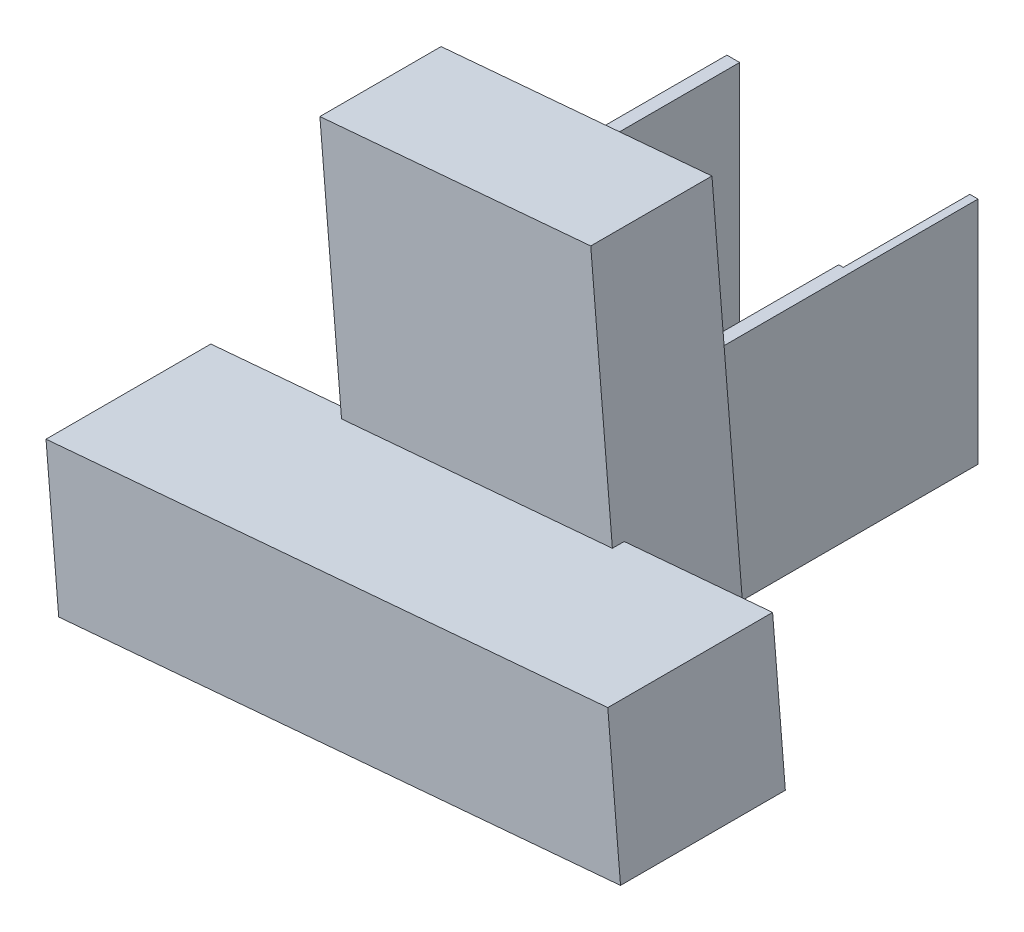
ISO-10303-21;
HEADER;
FILE_DESCRIPTION(('STEP AP214'),'2;1');
FILE_NAME('part.step','',(''),(''),'','','');
FILE_SCHEMA(('AUTOMOTIVE_DESIGN { 1 0 10303 214 1 1 1 1 }'));
ENDSEC;
DATA;
#1=APPLICATION_CONTEXT('core data for automotive mechanical design processes');
#2=APPLICATION_PROTOCOL_DEFINITION('international standard','automotive_design',2000,#1);
#3=PRODUCT_CONTEXT('',#1,'mechanical');
#4=PRODUCT('Part','Part','',(#3));
#5=PRODUCT_RELATED_PRODUCT_CATEGORY('part','',(#4));
#6=PRODUCT_DEFINITION_FORMATION('','',#4);
#7=PRODUCT_DEFINITION_CONTEXT('part definition',#1,'design');
#8=PRODUCT_DEFINITION('design','',#6,#7);
#9=PRODUCT_DEFINITION_SHAPE('','',#8);
#10=(LENGTH_UNIT() NAMED_UNIT(*) SI_UNIT(.MILLI.,.METRE.));
#11=(NAMED_UNIT(*) PLANE_ANGLE_UNIT() SI_UNIT($,.RADIAN.));
#12=(NAMED_UNIT(*) SI_UNIT($,.STERADIAN.) SOLID_ANGLE_UNIT());
#13=UNCERTAINTY_MEASURE_WITH_UNIT(LENGTH_MEASURE(1.E-05),#10,'distance_accuracy_value','');
#14=(GEOMETRIC_REPRESENTATION_CONTEXT(3) GLOBAL_UNCERTAINTY_ASSIGNED_CONTEXT((#13)) GLOBAL_UNIT_ASSIGNED_CONTEXT((#10,
#11,#12)) REPRESENTATION_CONTEXT('',''));
#15=CARTESIAN_POINT('',(0.,0.,0.));
#16=DIRECTION('',(0.,0.,1.));
#17=DIRECTION('',(1.,0.,0.));
#18=AXIS2_PLACEMENT_3D('',#15,#16,#17);
#19=CARTESIAN_POINT('',(-83.7586461575756,-4.10945026252005E-12,3.18615829159422E-12));
#20=DIRECTION('',(-1.,0.,0.));
#21=DIRECTION('',(0.,-1.,0.));
#22=AXIS2_PLACEMENT_3D('',#19,#20,#21);
#23=PLANE('',#22);
#24=DIRECTION('',(0.,1.,0.));
#25=VECTOR('',#24,1.);
#26=CARTESIAN_POINT('',(-83.7586461575911,-4.10945026252279E-12,-406.739222071192));
#27=LINE('',#26,#25);
#28=CARTESIAN_POINT('',(-83.7586461575777,-281.085149465199,-406.739222071192));
#29=VERTEX_POINT('',#28);
#30=CARTESIAN_POINT('',(-83.7586461575783,-260.42777062127,-406.739222071192));
#31=VERTEX_POINT('',#30);
#32=EDGE_CURVE('E547',#29,#31,#27,.T.);
#33=ORIENTED_EDGE('',*,*,#32,.F.);
#34=DIRECTION('',(0.,0.,1.));
#35=VECTOR('',#34,1.);
#36=CARTESIAN_POINT('',(-83.7586461575618,-281.085149465199,3.18615829159364E-12));
#37=LINE('',#36,#35);
#38=CARTESIAN_POINT('',(-83.7586461575781,-281.085149465199,-428.087784445097));
#39=VERTEX_POINT('',#38);
#40=EDGE_CURVE('E544',#39,#29,#37,.T.);
#41=ORIENTED_EDGE('',*,*,#40,.F.);
#42=DIRECTION('',(0.,1.,0.));
#43=VECTOR('',#42,1.);
#44=CARTESIAN_POINT('',(-83.7586461575791,-260.42777062127,-428.087784445097));
#45=LINE('',#44,#43);
#46=CARTESIAN_POINT('',(-83.7586461575772,-299.17786280097,-428.087784445097));
#47=VERTEX_POINT('',#46);
#48=EDGE_CURVE('E511',#47,#39,#45,.T.);
#49=ORIENTED_EDGE('',*,*,#48,.F.);
#50=DIRECTION('',(0.,0.,-1.));
#51=VECTOR('',#50,1.);
#52=CARTESIAN_POINT('',(-83.7586461575756,-299.17786280097,-384.674952402111));
#53=LINE('',#52,#51);
#54=CARTESIAN_POINT('',(-83.7586461575756,-299.17786280097,-384.674952402111));
#55=VERTEX_POINT('',#54);
#56=EDGE_CURVE('E507',#55,#47,#53,.T.);
#57=ORIENTED_EDGE('',*,*,#56,.F.);
#58=DIRECTION('',(0.,-1.,0.));
#59=VECTOR('',#58,1.);
#60=CARTESIAN_POINT('',(-83.7586461575775,-260.42777062127,-384.674952402111));
#61=LINE('',#60,#59);
#62=CARTESIAN_POINT('',(-83.7586461575756,-298.875536418522,-384.674952402235));
#63=VERTEX_POINT('',#62);
#64=EDGE_CURVE('E502',#63,#55,#61,.T.);
#65=ORIENTED_EDGE('',*,*,#64,.F.);
#66=CARTESIAN_POINT('',(-83.7586461575775,-260.42777062127,-384.674952402111));
#67=VERTEX_POINT('',#66);
#68=EDGE_CURVE('E503',#67,#63,#61,.T.);
#69=ORIENTED_EDGE('',*,*,#68,.F.);
#70=DIRECTION('',(0.,0.,1.));
#71=VECTOR('',#70,1.);
#72=CARTESIAN_POINT('',(-83.7586461575775,-260.42777062127,-384.674952402111));
#73=LINE('',#72,#71);
#74=EDGE_CURVE('E499',#31,#67,#73,.T.);
#75=ORIENTED_EDGE('',*,*,#74,.F.);
#76=EDGE_LOOP('',(#33,#41,#49,#57,#65,#69,#75));
#77=FACE_BOUND('',#76,.T.);
#78=DIRECTION('',(0.,0.,-1.));
#79=VECTOR('',#78,1.);
#80=CARTESIAN_POINT('',(-83.7586461575627,-262.531491805785,3.18615829159373E-12));
#81=LINE('',#80,#79);
#82=CARTESIAN_POINT('',(-83.7586461575772,-262.531491805785,-384.973256852288));
#83=VERTEX_POINT('',#82);
#84=CARTESIAN_POINT('',(-83.7586461575776,-262.531491805785,-389.973256852288));
#85=VERTEX_POINT('',#84);
#86=EDGE_CURVE('E315',#83,#85,#81,.T.);
#87=ORIENTED_EDGE('',*,*,#86,.F.);
#88=DIRECTION('',(0.,-1.,0.));
#89=VECTOR('',#88,1.);
#90=CARTESIAN_POINT('',(-83.7586461575902,-4.10945026252076E-12,-384.973256852288));
#91=LINE('',#90,#89);
#92=CARTESIAN_POINT('',(-83.7586461575772,-268.275386182561,-384.973256852288));
#93=VERTEX_POINT('',#92);
#94=EDGE_CURVE('E253',#83,#93,#91,.T.);
#95=ORIENTED_EDGE('',*,*,#94,.T.);
#96=DIRECTION('',(0.,0.,1.));
#97=VECTOR('',#96,1.);
#98=CARTESIAN_POINT('',(-83.7586461575625,-268.275386182561,3.18615829159372E-12));
#99=LINE('',#98,#97);
#100=CARTESIAN_POINT('',(-83.7586461575774,-268.275386182561,-389.973256852288));
#101=VERTEX_POINT('',#100);
#102=EDGE_CURVE('E312',#101,#93,#99,.T.);
#103=ORIENTED_EDGE('',*,*,#102,.F.);
#104=DIRECTION('',(0.,-1.,0.));
#105=VECTOR('',#104,1.);
#106=CARTESIAN_POINT('',(-83.7586461575904,-4.10945026252077E-12,-389.973256852288));
#107=LINE('',#106,#105);
#108=EDGE_CURVE('E301',#85,#101,#107,.T.);
#109=ORIENTED_EDGE('',*,*,#108,.F.);
#110=EDGE_LOOP('',(#87,#95,#103,#109));
#111=FACE_BOUND('',#110,.T.);
#112=ADVANCED_FACE('F43',(#77,#111),#23,.T.);
#113=CARTESIAN_POINT('',(-121.658646157551,2.05978052856057E-12,4.48779256114984E-12));
#114=DIRECTION('',(-1.,0.,0.));
#115=DIRECTION('',(0.,0.,1.));
#116=AXIS2_PLACEMENT_3D('',#113,#114,#115);
#117=PLANE('',#116);
#118=DIRECTION('',(0.,0.,-1.));
#119=VECTOR('',#118,1.);
#120=CARTESIAN_POINT('',(-121.658646157569,-260.427770621154,-384.674952402174));
#121=LINE('',#120,#119);
#122=CARTESIAN_POINT('',(-121.658646157569,-260.427770621154,-384.674952402174));
#123=VERTEX_POINT('',#122);
#124=CARTESIAN_POINT('',(-121.658646157571,-260.427770621154,-427.936944683927));
#125=VERTEX_POINT('',#124);
#126=EDGE_CURVE('E318',#123,#125,#121,.T.);
#127=ORIENTED_EDGE('',*,*,#126,.F.);
#128=DIRECTION('',(0.,1.,0.));
#129=VECTOR('',#128,1.);
#130=CARTESIAN_POINT('',(-121.658646157569,-260.427770621154,-384.674952402174));
#131=LINE('',#130,#129);
#132=CARTESIAN_POINT('',(-121.65864615757,-299.769559667941,-384.674952402174));
#133=VERTEX_POINT('',#132);
#134=EDGE_CURVE('E329',#133,#123,#131,.T.);
#135=ORIENTED_EDGE('',*,*,#134,.F.);
#136=DIRECTION('',(0.,0.,1.));
#137=VECTOR('',#136,1.);
#138=CARTESIAN_POINT('',(-121.65864615757,-299.769559667941,-384.674952402174));
#139=LINE('',#138,#137);
#140=CARTESIAN_POINT('',(-121.658646157571,-299.769559667941,-427.936944683927));
#141=VERTEX_POINT('',#140);
#142=EDGE_CURVE('E326',#141,#133,#139,.T.);
#143=ORIENTED_EDGE('',*,*,#142,.F.);
#144=DIRECTION('',(0.,-1.,0.));
#145=VECTOR('',#144,1.);
#146=CARTESIAN_POINT('',(-121.658646157571,-260.427770621154,-427.936944683927));
#147=LINE('',#146,#145);
#148=EDGE_CURVE('E322',#125,#141,#147,.T.);
#149=ORIENTED_EDGE('',*,*,#148,.F.);
#150=EDGE_LOOP('',(#127,#135,#143,#149));
#151=FACE_BOUND('',#150,.T.);
#152=DIRECTION('',(0.,-1.,0.));
#153=VECTOR('',#152,1.);
#154=CARTESIAN_POINT('',(-121.658646157565,2.05978052856081E-12,-384.973256852288));
#155=LINE('',#154,#153);
#156=CARTESIAN_POINT('',(-121.658646157569,-262.531491805785,-384.973256852288));
#157=VERTEX_POINT('',#156);
#158=CARTESIAN_POINT('',(-121.658646157569,-268.275386182561,-384.973256852288));
#159=VERTEX_POINT('',#158);
#160=EDGE_CURVE('E11',#157,#159,#155,.T.);
#161=ORIENTED_EDGE('',*,*,#160,.F.);
#162=DIRECTION('',(0.,0.,-1.));
#163=VECTOR('',#162,1.);
#164=CARTESIAN_POINT('',(-121.658646157555,-262.531491805785,4.48779256115E-12));
#165=LINE('',#164,#163);
#166=CARTESIAN_POINT('',(-121.658646157569,-262.531491805785,-389.973256852288));
#167=VERTEX_POINT('',#166);
#168=EDGE_CURVE('E52',#157,#167,#165,.T.);
#169=ORIENTED_EDGE('',*,*,#168,.T.);
#170=DIRECTION('',(0.,-1.,0.));
#171=VECTOR('',#170,1.);
#172=CARTESIAN_POINT('',(-121.658646157565,2.05978052856081E-12,-389.973256852288));
#173=LINE('',#172,#171);
#174=CARTESIAN_POINT('',(-121.658646157569,-268.275386182561,-389.973256852288));
#175=VERTEX_POINT('',#174);
#176=EDGE_CURVE('E554',#167,#175,#173,.T.);
#177=ORIENTED_EDGE('',*,*,#176,.T.);
#178=DIRECTION('',(0.,0.,1.));
#179=VECTOR('',#178,1.);
#180=CARTESIAN_POINT('',(-121.658646157555,-268.275386182561,4.48779256115001E-12));
#181=LINE('',#180,#179);
#182=EDGE_CURVE('E558',#175,#159,#181,.T.);
#183=ORIENTED_EDGE('',*,*,#182,.T.);
#184=EDGE_LOOP('',(#161,#169,#177,#183));
#185=FACE_BOUND('',#184,.T.);
#186=ADVANCED_FACE('F565',(#151,#185),#117,.F.);
#187=CARTESIAN_POINT('',(-77.7037066635407,-298.35351939984,-384.674952402234));
#188=DIRECTION('',(0.,3.23272787236292E-12,-1.));
#189=DIRECTION('',(0.,1.,3.23272787236292E-12));
#190=AXIS2_PLACEMENT_3D('',#187,#188,#189);
#191=PLANE('',#190);
#192=DIRECTION('',(1.,0.,0.));
#193=VECTOR('',#192,1.);
#194=CARTESIAN_POINT('',(-77.70370666354,-260.427770621154,-384.674952402111));
#195=LINE('',#194,#193);
#196=CARTESIAN_POINT('',(-123.808646157569,-260.427770621154,-384.674952402174));
#197=VERTEX_POINT('',#196);
#198=EDGE_CURVE('E478',#197,#123,#195,.T.);
#199=ORIENTED_EDGE('',*,*,#198,.F.);
#200=DIRECTION('',(0.,1.,0.));
#201=VECTOR('',#200,1.);
#202=CARTESIAN_POINT('',(-123.808646157569,-260.427770621154,-384.674952402174));
#203=LINE('',#202,#201);
#204=CARTESIAN_POINT('',(-123.80864615757,-297.43618521484,-384.674952402174));
#205=VERTEX_POINT('',#204);
#206=EDGE_CURVE('E343',#205,#197,#203,.T.);
#207=ORIENTED_EDGE('',*,*,#206,.F.);
#208=DIRECTION('',(-0.0858947897904414,0.996304213123108,3.22071536107416E-12));
#209=VECTOR('',#208,1.);
#210=CARTESIAN_POINT('',(-123.389984816589,-302.292289512999,-384.674952402247));
#211=LINE('',#210,#209);
#212=CARTESIAN_POINT('',(-128.758409178492,-240.023276192805,-384.674952402045));
#213=VERTEX_POINT('',#212);
#214=EDGE_CURVE('E486',#205,#213,#211,.T.);
#215=ORIENTED_EDGE('',*,*,#214,.T.);
#216=DIRECTION('',(-0.996304213123108,-0.0858947897904416,-2.78428865275491E-13));
#217=VECTOR('',#216,1.);
#218=CARTESIAN_POINT('',(-83.0721310254432,-236.084506079646,-384.674952402033));
#219=LINE('',#218,#217);
#220=CARTESIAN_POINT('',(-83.0721310254432,-236.084506079646,-384.674952402033));
#221=VERTEX_POINT('',#220);
#222=EDGE_CURVE('E464',#221,#213,#219,.T.);
#223=ORIENTED_EDGE('',*,*,#222,.F.);
#224=DIRECTION('',(-0.0858947897904414,0.996304213123108,3.22071536107416E-12));
#225=VECTOR('',#224,1.);
#226=CARTESIAN_POINT('',(-77.7037066635407,-298.35351939984,-384.674952402234));
#227=LINE('',#226,#225);
#228=CARTESIAN_POINT('',(-77.7037066635407,-298.35351939984,-384.674952402234));
#229=VERTEX_POINT('',#228);
#230=EDGE_CURVE('E460',#229,#221,#227,.T.);
#231=ORIENTED_EDGE('',*,*,#230,.F.);
#232=DIRECTION('',(-0.996304213123108,-0.0858947897904416,-2.78428865275491E-13));
#233=VECTOR('',#232,1.);
#234=CARTESIAN_POINT('',(-77.7037066635407,-298.35351939984,-384.674952402234));
#235=LINE('',#234,#233);
#236=CARTESIAN_POINT('',(-81.6086461575756,-298.690177573686,-384.674952402111));
#237=VERTEX_POINT('',#236);
#238=EDGE_CURVE('E451',#229,#237,#235,.T.);
#239=ORIENTED_EDGE('',*,*,#238,.T.);
#240=DIRECTION('',(0.,-1.,0.));
#241=VECTOR('',#240,1.);
#242=CARTESIAN_POINT('',(-81.6086461575775,-260.42777062127,-384.674952402111));
#243=LINE('',#242,#241);
#244=CARTESIAN_POINT('',(-81.6086461575775,-260.42777062127,-384.674952402111));
#245=VERTEX_POINT('',#244);
#246=EDGE_CURVE('E519',#245,#237,#243,.T.);
#247=ORIENTED_EDGE('',*,*,#246,.F.);
#248=DIRECTION('',(-1.,0.,0.));
#249=VECTOR('',#248,1.);
#250=CARTESIAN_POINT('',(-81.6086461575775,-260.42777062127,-384.674952402111));
#251=LINE('',#250,#249);
#252=EDGE_CURVE('E540',#245,#67,#251,.T.);
#253=ORIENTED_EDGE('',*,*,#252,.T.);
#254=ORIENTED_EDGE('',*,*,#68,.T.);
#255=CARTESIAN_POINT('',(-123.389984816589,-302.292289512999,-384.674952402247));
#256=VERTEX_POINT('',#255);
#257=EDGE_CURVE('E449',#63,#256,#235,.T.);
#258=ORIENTED_EDGE('',*,*,#257,.T.);
#259=CARTESIAN_POINT('',(-123.607477974688,-299.769559667941,-384.674952402174));
#260=VERTEX_POINT('',#259);
#261=EDGE_CURVE('E482',#256,#260,#211,.T.);
#262=ORIENTED_EDGE('',*,*,#261,.T.);
#263=DIRECTION('',(1.,0.,0.));
#264=VECTOR('',#263,1.);
#265=CARTESIAN_POINT('',(-123.80864615757,-299.769559667941,-384.674952402174));
#266=LINE('',#265,#264);
#267=EDGE_CURVE('E348',#260,#133,#266,.T.);
#268=ORIENTED_EDGE('',*,*,#267,.T.);
#269=ORIENTED_EDGE('',*,*,#134,.T.);
#270=EDGE_LOOP('',(#199,#207,#215,#223,#231,#239,#247,#253,#254,#258,#262,#268,#269));
#271=FACE_BOUND('',#270,.T.);
#272=ADVANCED_FACE('F598',(#271),#191,.T.);
#273=CARTESIAN_POINT('',(-81.6086461575775,-260.42777062127,-384.674952402111));
#274=DIRECTION('',(0.,0.,-1.));
#275=DIRECTION('',(-1.,0.,0.));
#276=AXIS2_PLACEMENT_3D('',#273,#274,#275);
#277=PLANE('',#276);
#278=EDGE_CURVE('E456',#237,#63,#235,.T.);
#279=ORIENTED_EDGE('',*,*,#278,.T.);
#280=ORIENTED_EDGE('',*,*,#64,.T.);
#281=DIRECTION('',(-1.,0.,0.));
#282=VECTOR('',#281,1.);
#283=CARTESIAN_POINT('',(-81.6086461575756,-299.17786280097,-384.674952402111));
#284=LINE('',#283,#282);
#285=CARTESIAN_POINT('',(-81.6086461575756,-299.17786280097,-384.674952402111));
#286=VERTEX_POINT('',#285);
#287=EDGE_CURVE('E536',#286,#55,#284,.T.);
#288=ORIENTED_EDGE('',*,*,#287,.F.);
#289=EDGE_CURVE('E518',#237,#286,#243,.T.);
#290=ORIENTED_EDGE('',*,*,#289,.F.);
#291=EDGE_LOOP('',(#279,#280,#288,#290));
#292=FACE_BOUND('',#291,.T.);
#293=ADVANCED_FACE('F619',(#292),#277,.F.);
#294=CARTESIAN_POINT('',(-81.6086461575775,-260.42777062127,-384.674952402111));
#295=DIRECTION('',(0.,-1.,0.));
#296=DIRECTION('',(1.,0.,0.));
#297=AXIS2_PLACEMENT_3D('',#294,#295,#296);
#298=PLANE('',#297);
#299=DIRECTION('',(0.,0.,1.));
#300=VECTOR('',#299,1.);
#301=CARTESIAN_POINT('',(-82.9886461575637,-260.42777062127,-384.674952402111));
#302=LINE('',#301,#300);
#303=CARTESIAN_POINT('',(-82.9886461575654,-260.42777062127,-428.087784445097));
#304=VERTEX_POINT('',#303);
#305=CARTESIAN_POINT('',(-82.9886461575645,-260.42777062127,-406.739222071192));
#306=VERTEX_POINT('',#305);
#307=EDGE_CURVE('E382',#304,#306,#302,.T.);
#308=ORIENTED_EDGE('',*,*,#307,.T.);
#309=DIRECTION('',(-1.,0.,0.));
#310=VECTOR('',#309,1.);
#311=CARTESIAN_POINT('',(-81.6086461575783,-260.42777062127,-406.739222071192));
#312=LINE('',#311,#310);
#313=EDGE_CURVE('E378',#306,#31,#312,.T.);
#314=ORIENTED_EDGE('',*,*,#313,.T.);
#315=ORIENTED_EDGE('',*,*,#74,.T.);
#316=ORIENTED_EDGE('',*,*,#252,.F.);
#317=DIRECTION('',(0.,0.,1.));
#318=VECTOR('',#317,1.);
#319=CARTESIAN_POINT('',(-81.6086461575775,-260.42777062127,-384.674952402111));
#320=LINE('',#319,#318);
#321=CARTESIAN_POINT('',(-81.6086461575791,-260.42777062127,-428.087784445097));
#322=VERTEX_POINT('',#321);
#323=EDGE_CURVE('E515',#322,#245,#320,.T.);
#324=ORIENTED_EDGE('',*,*,#323,.F.);
#325=DIRECTION('',(-1.,0.,0.));
#326=VECTOR('',#325,1.);
#327=CARTESIAN_POINT('',(-81.6086461575791,-260.42777062127,-428.087784445097));
#328=LINE('',#327,#326);
#329=EDGE_CURVE('E529',#322,#304,#328,.T.);
#330=ORIENTED_EDGE('',*,*,#329,.T.);
#331=EDGE_LOOP('',(#308,#314,#315,#316,#324,#330));
#332=FACE_BOUND('',#331,.T.);
#333=ADVANCED_FACE('F45',(#332),#298,.F.);
#334=CARTESIAN_POINT('',(-81.6086461575756,-299.17786280097,-384.674952402111));
#335=DIRECTION('',(0.,1.,0.));
#336=DIRECTION('',(-1.,0.,0.));
#337=AXIS2_PLACEMENT_3D('',#334,#335,#336);
#338=PLANE('',#337);
#339=ORIENTED_EDGE('',*,*,#287,.T.);
#340=ORIENTED_EDGE('',*,*,#56,.T.);
#341=DIRECTION('',(-1.,0.,0.));
#342=VECTOR('',#341,1.);
#343=CARTESIAN_POINT('',(-81.6086461575772,-299.17786280097,-428.087784445097));
#344=LINE('',#343,#342);
#345=CARTESIAN_POINT('',(-81.6086461575772,-299.17786280097,-428.087784445097));
#346=VERTEX_POINT('',#345);
#347=EDGE_CURVE('E533',#346,#47,#344,.T.);
#348=ORIENTED_EDGE('',*,*,#347,.F.);
#349=DIRECTION('',(0.,0.,-1.));
#350=VECTOR('',#349,1.);
#351=CARTESIAN_POINT('',(-81.6086461575756,-299.17786280097,-384.674952402111));
#352=LINE('',#351,#350);
#353=EDGE_CURVE('E523',#286,#346,#352,.T.);
#354=ORIENTED_EDGE('',*,*,#353,.F.);
#355=EDGE_LOOP('',(#339,#340,#348,#354));
#356=FACE_BOUND('',#355,.T.);
#357=ADVANCED_FACE('F615',(#356),#338,.F.);
#358=CARTESIAN_POINT('',(-81.6086461575791,-260.42777062127,-428.087784445097));
#359=DIRECTION('',(0.,0.,1.));
#360=DIRECTION('',(1.,0.,0.));
#361=AXIS2_PLACEMENT_3D('',#358,#359,#360);
#362=PLANE('',#361);
#363=ORIENTED_EDGE('',*,*,#48,.T.);
#364=DIRECTION('',(1.,1.73666933092613E-13,0.));
#365=VECTOR('',#364,1.);
#366=CARTESIAN_POINT('',(-81.6086461575755,-281.085149465198,-428.087784445097));
#367=LINE('',#366,#365);
#368=CARTESIAN_POINT('',(-82.9886461575618,-281.085149465199,-428.087784445097));
#369=VERTEX_POINT('',#368);
#370=EDGE_CURVE('E374',#39,#369,#367,.T.);
#371=ORIENTED_EDGE('',*,*,#370,.T.);
#372=DIRECTION('',(-1.73776465244596E-13,1.,0.));
#373=VECTOR('',#372,1.);
#374=CARTESIAN_POINT('',(-82.9886461575654,-260.42777062127,-428.087784445097));
#375=LINE('',#374,#373);
#376=EDGE_CURVE('E550',#369,#304,#375,.T.);
#377=ORIENTED_EDGE('',*,*,#376,.T.);
#378=ORIENTED_EDGE('',*,*,#329,.F.);
#379=DIRECTION('',(0.,1.,0.));
#380=VECTOR('',#379,1.);
#381=CARTESIAN_POINT('',(-81.6086461575791,-260.42777062127,-428.087784445097));
#382=LINE('',#381,#380);
#383=EDGE_CURVE('E526',#346,#322,#382,.T.);
#384=ORIENTED_EDGE('',*,*,#383,.F.);
#385=ORIENTED_EDGE('',*,*,#347,.T.);
#386=EDGE_LOOP('',(#363,#371,#377,#378,#384,#385));
#387=FACE_BOUND('',#386,.T.);
#388=ADVANCED_FACE('F611',(#387),#362,.F.);
#389=CARTESIAN_POINT('',(-81.6086461575756,-4.00410026252005E-12,3.10445829159422E-12));
#390=DIRECTION('',(-1.,0.,0.));
#391=DIRECTION('',(0.,-1.,0.));
#392=AXIS2_PLACEMENT_3D('',#389,#390,#391);
#393=PLANE('',#392);
#394=ORIENTED_EDGE('',*,*,#323,.T.);
#395=ORIENTED_EDGE('',*,*,#246,.T.);
#396=ORIENTED_EDGE('',*,*,#289,.T.);
#397=ORIENTED_EDGE('',*,*,#353,.T.);
#398=ORIENTED_EDGE('',*,*,#383,.T.);
#399=EDGE_LOOP('',(#394,#395,#396,#397,#398));
#400=FACE_BOUND('',#399,.T.);
#401=ADVANCED_FACE('F607',(#400),#393,.F.);
#402=CARTESIAN_POINT('',(-77.7037066635407,-298.353519399906,-364.230635772042));
#403=DIRECTION('',(0.,-3.23272787236292E-12,1.));
#404=DIRECTION('',(0.,-1.,-3.23272787236292E-12));
#405=AXIS2_PLACEMENT_3D('',#402,#403,#404);
#406=PLANE('',#405);
#407=DIRECTION('',(-0.0858947897904414,0.996304213123108,3.22071536107416E-12));
#408=VECTOR('',#407,1.);
#409=CARTESIAN_POINT('',(-123.389984816589,-302.292289513065,-364.230635772055));
#410=LINE('',#409,#408);
#411=CARTESIAN_POINT('',(-125.107880612398,-282.366205250605,-364.230635771854));
#412=VERTEX_POINT('',#411);
#413=CARTESIAN_POINT('',(-128.758409178492,-240.023276192871,-364.230635771854));
#414=VERTEX_POINT('',#413);
#415=EDGE_CURVE('E479',#412,#414,#410,.T.);
#416=ORIENTED_EDGE('',*,*,#415,.F.);
#417=DIRECTION('',(0.99630421312311,0.0858947897904264,2.78428865275442E-13));
#418=VECTOR('',#417,1.);
#419=CARTESIAN_POINT('',(-79.421602459349,-278.427435137446,-364.230635771978));
#420=LINE('',#419,#418);
#421=CARTESIAN_POINT('',(-79.4216024593493,-278.427435137446,-364.230635771978));
#422=VERTEX_POINT('',#421);
#423=EDGE_CURVE('E437',#412,#422,#420,.T.);
#424=ORIENTED_EDGE('',*,*,#423,.T.);
#425=DIRECTION('',(-0.0858947897904414,0.996304213123108,3.22071536107416E-12));
#426=VECTOR('',#425,1.);
#427=CARTESIAN_POINT('',(-77.7037066635407,-298.353519399906,-364.230635772042));
#428=LINE('',#427,#426);
#429=CARTESIAN_POINT('',(-83.0721310254432,-236.084506079712,-364.230635771841));
#430=VERTEX_POINT('',#429);
#431=EDGE_CURVE('E475',#422,#430,#428,.T.);
#432=ORIENTED_EDGE('',*,*,#431,.T.);
#433=DIRECTION('',(0.996304213123108,0.0858947897904416,2.78428865275491E-13));
#434=VECTOR('',#433,1.);
#435=CARTESIAN_POINT('',(-83.0721310254432,-236.084506079712,-364.230635771841));
#436=LINE('',#435,#434);
#437=EDGE_CURVE('E450',#414,#430,#436,.T.);
#438=ORIENTED_EDGE('',*,*,#437,.F.);
#439=EDGE_LOOP('',(#416,#424,#432,#438));
#440=FACE_BOUND('',#439,.T.);
#441=ADVANCED_FACE('F610',(#440),#406,.T.);
#442=CARTESIAN_POINT('',(-77.7037066635407,-298.353519399906,-364.230635772042));
#443=DIRECTION('',(0.996304213123108,0.0858947897904414,2.7765395021964E-13));
#444=DIRECTION('',(-0.0858947897904414,0.996304213123108,0.));
#445=AXIS2_PLACEMENT_3D('',#442,#443,#444);
#446=PLANE('',#445);
#447=DIRECTION('',(-0.0858947897904414,0.996304213123108,3.20984905322064E-12));
#448=VECTOR('',#447,1.);
#449=CARTESIAN_POINT('',(-77.7037066635407,-298.3535193999,-366.220450252685));
#450=LINE('',#449,#448);
#451=CARTESIAN_POINT('',(-77.7037066635407,-298.3535193999,-366.220450252685));
#452=VERTEX_POINT('',#451);
#453=CARTESIAN_POINT('',(-79.4216024593496,-278.42743513744,-366.220450252621));
#454=VERTEX_POINT('',#453);
#455=EDGE_CURVE('E434',#452,#454,#450,.T.);
#456=ORIENTED_EDGE('',*,*,#455,.F.);
#457=DIRECTION('',(0.,3.23248884940561E-12,-1.));
#458=VECTOR('',#457,1.);
#459=CARTESIAN_POINT('',(-77.7037066635407,-298.353519399906,-364.230635772042));
#460=LINE('',#459,#458);
#461=EDGE_CURVE('E446',#452,#229,#460,.T.);
#462=ORIENTED_EDGE('',*,*,#461,.T.);
#463=ORIENTED_EDGE('',*,*,#230,.T.);
#464=DIRECTION('',(0.,3.23248884940561E-12,-1.));
#465=VECTOR('',#464,1.);
#466=CARTESIAN_POINT('',(-83.0721310254432,-236.084506079712,-364.230635771841));
#467=LINE('',#466,#465);
#468=EDGE_CURVE('E445',#430,#221,#467,.T.);
#469=ORIENTED_EDGE('',*,*,#468,.F.);
#470=ORIENTED_EDGE('',*,*,#431,.F.);
#471=DIRECTION('',(0.,3.22085085450588E-12,-1.));
#472=VECTOR('',#471,1.);
#473=CARTESIAN_POINT('',(-79.4216024593493,-278.427435137446,-364.230635771978));
#474=LINE('',#473,#472);
#475=EDGE_CURVE('E441',#422,#454,#474,.T.);
#476=ORIENTED_EDGE('',*,*,#475,.T.);
#477=EDGE_LOOP('',(#456,#462,#463,#469,#470,#476));
#478=FACE_BOUND('',#477,.T.);
#479=ADVANCED_FACE('F605',(#478),#446,.T.);
#480=CARTESIAN_POINT('',(-123.389984816589,-302.292289513065,-364.230635772055));
#481=DIRECTION('',(-0.996304213123108,-0.0858947897904414,-2.7765395021964E-13));
#482=DIRECTION('',(0.0858947897904414,-0.996304213123108,0.));
#483=AXIS2_PLACEMENT_3D('',#480,#481,#482);
#484=PLANE('',#483);
#485=DIRECTION('',(0.0858947897904414,-0.996304213123108,-3.20984905322064E-12));
#486=VECTOR('',#485,1.);
#487=CARTESIAN_POINT('',(-123.389984816589,-302.292289513059,-366.220450252698));
#488=LINE('',#487,#486);
#489=CARTESIAN_POINT('',(-125.107880612398,-282.366205250598,-366.220450252634));
#490=VERTEX_POINT('',#489);
#491=CARTESIAN_POINT('',(-123.389984816589,-302.292289513059,-366.220450252692));
#492=VERTEX_POINT('',#491);
#493=EDGE_CURVE('E423',#490,#492,#488,.T.);
#494=ORIENTED_EDGE('',*,*,#493,.F.);
#495=DIRECTION('',(0.,-3.22085085450588E-12,1.));
#496=VECTOR('',#495,1.);
#497=CARTESIAN_POINT('',(-125.107880612398,-282.366205250605,-364.230635771991));
#498=LINE('',#497,#496);
#499=EDGE_CURVE('E495',#490,#412,#498,.T.);
#500=ORIENTED_EDGE('',*,*,#499,.T.);
#501=ORIENTED_EDGE('',*,*,#415,.T.);
#502=DIRECTION('',(0.,-3.23248884940561E-12,1.));
#503=VECTOR('',#502,1.);
#504=CARTESIAN_POINT('',(-128.758409178492,-240.023276192871,-364.230635771854));
#505=LINE('',#504,#503);
#506=EDGE_CURVE('E468',#213,#414,#505,.T.);
#507=ORIENTED_EDGE('',*,*,#506,.F.);
#508=ORIENTED_EDGE('',*,*,#214,.F.);
#509=DIRECTION('',(0.0858947897904414,-0.996304213123108,0.));
#510=VECTOR('',#509,1.);
#511=CARTESIAN_POINT('',(-123.389984816583,-302.292289513065,-384.674952402174));
#512=LINE('',#511,#510);
#513=EDGE_CURVE('E359',#205,#260,#512,.T.);
#514=ORIENTED_EDGE('',*,*,#513,.T.);
#515=ORIENTED_EDGE('',*,*,#261,.F.);
#516=DIRECTION('',(0.,-3.23248884940561E-12,1.));
#517=VECTOR('',#516,1.);
#518=CARTESIAN_POINT('',(-123.389984816589,-302.292289513065,-364.230635772055));
#519=LINE('',#518,#517);
#520=EDGE_CURVE('E455',#256,#492,#519,.T.);
#521=ORIENTED_EDGE('',*,*,#520,.T.);
#522=EDGE_LOOP('',(#494,#500,#501,#507,#508,#514,#515,#521));
#523=FACE_BOUND('',#522,.T.);
#524=ADVANCED_FACE('F673',(#523),#484,.T.);
#525=CARTESIAN_POINT('',(24.9590095182758,-289.502615922406,-9.35824796689049E-10));
#526=DIRECTION('',(-0.0858947897904416,0.996304213123108,3.22054225953627E-12));
#527=DIRECTION('',(-0.996304213123108,-0.0858947897904416,0.));
#528=AXIS2_PLACEMENT_3D('',#525,#526,#527);
#529=PLANE('',#528);
#530=ORIENTED_EDGE('',*,*,#461,.F.);
#531=DIRECTION('',(-0.996304213123108,-0.0858947897904416,-2.77234485607596E-13));
#532=VECTOR('',#531,1.);
#533=CARTESIAN_POINT('',(24.9590095182757,-289.502615921222,-366.220450252657));
#534=LINE('',#533,#532);
#535=EDGE_CURVE('E491',#452,#492,#534,.T.);
#536=ORIENTED_EDGE('',*,*,#535,.T.);
#537=ORIENTED_EDGE('',*,*,#520,.F.);
#538=ORIENTED_EDGE('',*,*,#257,.F.);
#539=ORIENTED_EDGE('',*,*,#278,.F.);
#540=ORIENTED_EDGE('',*,*,#238,.F.);
#541=EDGE_LOOP('',(#530,#536,#537,#538,#539,#540));
#542=FACE_BOUND('',#541,.T.);
#543=ADVANCED_FACE('F642',(#542),#529,.F.);
#544=CARTESIAN_POINT('',(19.5905851563733,-227.233602602212,-7.34530086621914E-10));
#545=DIRECTION('',(-0.0858947897904416,0.996304213123108,3.22054225953627E-12));
#546=DIRECTION('',(-0.996304213123108,-0.0858947897904416,0.));
#547=AXIS2_PLACEMENT_3D('',#544,#545,#546);
#548=PLANE('',#547);
#549=ORIENTED_EDGE('',*,*,#468,.T.);
#550=ORIENTED_EDGE('',*,*,#222,.T.);
#551=ORIENTED_EDGE('',*,*,#506,.T.);
#552=ORIENTED_EDGE('',*,*,#437,.T.);
#553=EDGE_LOOP('',(#549,#550,#551,#552));
#554=FACE_BOUND('',#553,.T.);
#555=ADVANCED_FACE('F715',(#554),#548,.T.);
#556=CARTESIAN_POINT('',(-123.708646157571,-260.427770621153,-427.633256852375));
#557=DIRECTION('',(0.,1.,0.));
#558=DIRECTION('',(-1.,0.,0.));
#559=AXIS2_PLACEMENT_3D('',#556,#557,#558);
#560=PLANE('',#559);
#561=ORIENTED_EDGE('',*,*,#198,.T.);
#562=ORIENTED_EDGE('',*,*,#126,.T.);
#563=DIRECTION('',(1.,0.,0.));
#564=VECTOR('',#563,1.);
#565=CARTESIAN_POINT('',(-123.808646157571,-260.427770621154,-427.936944683927));
#566=LINE('',#565,#564);
#567=CARTESIAN_POINT('',(-123.808646157571,-260.427770621154,-427.936944683927));
#568=VERTEX_POINT('',#567);
#569=EDGE_CURVE('E356',#568,#125,#566,.T.);
#570=ORIENTED_EDGE('',*,*,#569,.F.);
#571=DIRECTION('',(0.,0.,-1.));
#572=VECTOR('',#571,1.);
#573=CARTESIAN_POINT('',(-123.808646157569,-260.427770621154,-384.674952402174));
#574=LINE('',#573,#572);
#575=EDGE_CURVE('E333',#197,#568,#574,.T.);
#576=ORIENTED_EDGE('',*,*,#575,.F.);
#577=EDGE_LOOP('',(#561,#562,#570,#576));
#578=FACE_BOUND('',#577,.T.);
#579=ADVANCED_FACE('F657',(#578),#560,.T.);
#580=CARTESIAN_POINT('',(-149.144714064946,-284.438502777236,-366.22045025264));
#581=DIRECTION('',(0.,3.22179913307687E-12,-1.));
#582=DIRECTION('',(0.,1.,3.22179913307687E-12));
#583=AXIS2_PLACEMENT_3D('',#580,#581,#582);
#584=PLANE('',#583);
#585=ORIENTED_EDGE('',*,*,#535,.F.);
#586=ORIENTED_EDGE('',*,*,#455,.T.);
#587=DIRECTION('',(0.996304213123109,0.0858947897904264,2.77234485607547E-13));
#588=VECTOR('',#587,1.);
#589=CARTESIAN_POINT('',(-149.144714064946,-284.438502777236,-366.22045025264));
#590=LINE('',#589,#588);
#591=CARTESIAN_POINT('',(-54.3861308397657,-276.269041602871,-366.220450252614));
#592=VERTEX_POINT('',#591);
#593=EDGE_CURVE('E392',#454,#592,#590,.T.);
#594=ORIENTED_EDGE('',*,*,#593,.T.);
#595=DIRECTION('',(0.0858947897904265,-0.996304213123109,-3.20984905322064E-12));
#596=VECTOR('',#595,1.);
#597=CARTESIAN_POINT('',(-54.3861308397657,-276.269041602871,-366.220450252614));
#598=LINE('',#597,#596);
#599=CARTESIAN_POINT('',(-52.238761095005,-301.176646930949,-366.220450252694));
#600=VERTEX_POINT('',#599);
#601=EDGE_CURVE('E404',#592,#600,#598,.T.);
#602=ORIENTED_EDGE('',*,*,#601,.T.);
#603=DIRECTION('',(0.996304213123109,0.0858947897904264,2.77234485607547E-13));
#604=VECTOR('',#603,1.);
#605=CARTESIAN_POINT('',(-146.997344320185,-309.346108105314,-366.220450252721));
#606=LINE('',#605,#604);
#607=CARTESIAN_POINT('',(-146.997344320185,-309.346108105314,-366.220450252721));
#608=VERTEX_POINT('',#607);
#609=EDGE_CURVE('E386',#608,#600,#606,.T.);
#610=ORIENTED_EDGE('',*,*,#609,.F.);
#611=DIRECTION('',(0.0858947897904265,-0.996304213123109,-3.20984905322064E-12));
#612=VECTOR('',#611,1.);
#613=CARTESIAN_POINT('',(-149.144714064946,-284.438502777236,-366.22045025264));
#614=LINE('',#613,#612);
#615=CARTESIAN_POINT('',(-149.144714064946,-284.438502777236,-366.22045025264));
#616=VERTEX_POINT('',#615);
#617=EDGE_CURVE('E420',#616,#608,#614,.T.);
#618=ORIENTED_EDGE('',*,*,#617,.F.);
#619=EDGE_CURVE('E387',#616,#490,#590,.T.);
#620=ORIENTED_EDGE('',*,*,#619,.T.);
#621=ORIENTED_EDGE('',*,*,#493,.T.);
#622=EDGE_LOOP('',(#585,#586,#594,#602,#610,#618,#620,#621));
#623=FACE_BOUND('',#622,.T.);
#624=ADVANCED_FACE('F693',(#623),#584,.T.);
#625=CARTESIAN_POINT('',(-149.144714064946,-284.438502777236,-366.22045025264));
#626=DIRECTION('',(-0.996304213123109,-0.0858947897904265,-2.76646876993525E-13));
#627=DIRECTION('',(0.0858947897904265,-0.99630421312311,0.));
#628=AXIS2_PLACEMENT_3D('',#625,#626,#627);
#629=PLANE('',#628);
#630=DIRECTION('',(0.,3.22076435216282E-12,-1.));
#631=VECTOR('',#630,1.);
#632=CARTESIAN_POINT('',(-146.997344320185,-309.346108105314,-366.220450252721));
#633=LINE('',#632,#631);
#634=CARTESIAN_POINT('',(-146.997344320185,-309.346108105404,-338.419755403409));
#635=VERTEX_POINT('',#634);
#636=EDGE_CURVE('E416',#635,#608,#633,.T.);
#637=ORIENTED_EDGE('',*,*,#636,.F.);
#638=DIRECTION('',(0.0858947897904265,-0.996304213123109,-3.20984905322064E-12));
#639=VECTOR('',#638,1.);
#640=CARTESIAN_POINT('',(-149.144714064946,-284.438502777326,-338.419755403329));
#641=LINE('',#640,#639);
#642=CARTESIAN_POINT('',(-149.144714064946,-284.438502777326,-338.419755403329));
#643=VERTEX_POINT('',#642);
#644=EDGE_CURVE('E424',#643,#635,#641,.T.);
#645=ORIENTED_EDGE('',*,*,#644,.F.);
#646=DIRECTION('',(0.,3.22076435216282E-12,-1.));
#647=VECTOR('',#646,1.);
#648=CARTESIAN_POINT('',(-149.144714064946,-284.438502777236,-366.22045025264));
#649=LINE('',#648,#647);
#650=EDGE_CURVE('E400',#643,#616,#649,.T.);
#651=ORIENTED_EDGE('',*,*,#650,.T.);
#652=ORIENTED_EDGE('',*,*,#617,.T.);
#653=EDGE_LOOP('',(#637,#645,#651,#652));
#654=FACE_BOUND('',#653,.T.);
#655=ADVANCED_FACE('F710',(#654),#629,.T.);
#656=CARTESIAN_POINT('',(-149.144714064946,-284.438502777326,-338.419755403329));
#657=DIRECTION('',(0.,-3.22179913307687E-12,1.));
#658=DIRECTION('',(0.,-1.,-3.22179913307687E-12));
#659=AXIS2_PLACEMENT_3D('',#656,#657,#658);
#660=PLANE('',#659);
#661=DIRECTION('',(-0.996304213123109,-0.0858947897904264,-2.77234485607547E-13));
#662=VECTOR('',#661,1.);
#663=CARTESIAN_POINT('',(-146.997344320185,-309.346108105404,-338.419755403409));
#664=LINE('',#663,#662);
#665=CARTESIAN_POINT('',(-52.238761095005,-301.176646931039,-338.419755403383));
#666=VERTEX_POINT('',#665);
#667=EDGE_CURVE('E412',#666,#635,#664,.T.);
#668=ORIENTED_EDGE('',*,*,#667,.F.);
#669=DIRECTION('',(0.0858947897904265,-0.996304213123109,-3.20984905322064E-12));
#670=VECTOR('',#669,1.);
#671=CARTESIAN_POINT('',(-54.3861308397657,-276.269041602961,-338.419755403303));
#672=LINE('',#671,#670);
#673=CARTESIAN_POINT('',(-54.3861308397657,-276.269041602961,-338.419755403303));
#674=VERTEX_POINT('',#673);
#675=EDGE_CURVE('E427',#674,#666,#672,.T.);
#676=ORIENTED_EDGE('',*,*,#675,.F.);
#677=DIRECTION('',(-0.996304213123109,-0.0858947897904264,-2.77234485607547E-13));
#678=VECTOR('',#677,1.);
#679=CARTESIAN_POINT('',(-149.144714064946,-284.438502777326,-338.419755403329));
#680=LINE('',#679,#678);
#681=EDGE_CURVE('E396',#674,#643,#680,.T.);
#682=ORIENTED_EDGE('',*,*,#681,.T.);
#683=ORIENTED_EDGE('',*,*,#644,.T.);
#684=EDGE_LOOP('',(#668,#676,#682,#683));
#685=FACE_BOUND('',#684,.T.);
#686=ADVANCED_FACE('F784',(#685),#660,.T.);
#687=CARTESIAN_POINT('',(-54.3861308397657,-276.269041602871,-366.220450252614));
#688=DIRECTION('',(0.996304213123109,0.0858947897904265,2.76646876993525E-13));
#689=DIRECTION('',(-0.0858947897904265,0.99630421312311,0.));
#690=AXIS2_PLACEMENT_3D('',#687,#688,#689);
#691=PLANE('',#690);
#692=DIRECTION('',(0.,-3.22076435216282E-12,1.));
#693=VECTOR('',#692,1.);
#694=CARTESIAN_POINT('',(-52.238761095005,-301.176646930949,-366.220450252694));
#695=LINE('',#694,#693);
#696=EDGE_CURVE('E408',#600,#666,#695,.T.);
#697=ORIENTED_EDGE('',*,*,#696,.F.);
#698=ORIENTED_EDGE('',*,*,#601,.F.);
#699=DIRECTION('',(0.,-3.22076435216282E-12,1.));
#700=VECTOR('',#699,1.);
#701=CARTESIAN_POINT('',(-54.3861308397657,-276.269041602871,-366.220450252614));
#702=LINE('',#701,#700);
#703=EDGE_CURVE('E391',#592,#674,#702,.T.);
#704=ORIENTED_EDGE('',*,*,#703,.T.);
#705=ORIENTED_EDGE('',*,*,#675,.T.);
#706=EDGE_LOOP('',(#697,#698,#704,#705));
#707=FACE_BOUND('',#706,.T.);
#708=ADVANCED_FACE('F702',(#707),#691,.T.);
#709=CARTESIAN_POINT('',(23.2411137224629,-269.576531659943,-8.68217784357935E-10));
#710=DIRECTION('',(0.0858947897904264,-0.99630421312311,-3.20886109353654E-12));
#711=DIRECTION('',(0.99630421312311,0.0858947897904264,0.));
#712=AXIS2_PLACEMENT_3D('',#709,#710,#711);
#713=PLANE('',#712);
#714=ORIENTED_EDGE('',*,*,#475,.F.);
#715=ORIENTED_EDGE('',*,*,#423,.F.);
#716=ORIENTED_EDGE('',*,*,#499,.F.);
#717=ORIENTED_EDGE('',*,*,#619,.F.);
#718=ORIENTED_EDGE('',*,*,#650,.F.);
#719=ORIENTED_EDGE('',*,*,#681,.F.);
#720=ORIENTED_EDGE('',*,*,#703,.F.);
#721=ORIENTED_EDGE('',*,*,#593,.F.);
#722=EDGE_LOOP('',(#714,#715,#716,#717,#718,#719,#720,#721));
#723=FACE_BOUND('',#722,.T.);
#724=ADVANCED_FACE('F697',(#723),#713,.F.);
#725=CARTESIAN_POINT('',(-49.6152919133124,-300.950468690493,-366.133256854305));
#726=DIRECTION('',(0.0858947897904265,-0.99630421312311,-3.20984905322064E-12));
#727=DIRECTION('',(-0.996276576071269,-0.0858924071057975,0.00744838058115036));
#728=AXIS2_PLACEMENT_3D('',#725,#726,#727);
#729=PLANE('',#728);
#730=ORIENTED_EDGE('',*,*,#609,.T.);
#731=ORIENTED_EDGE('',*,*,#696,.T.);
#732=ORIENTED_EDGE('',*,*,#667,.T.);
#733=ORIENTED_EDGE('',*,*,#636,.T.);
#734=EDGE_LOOP('',(#730,#731,#732,#733));
#735=FACE_BOUND('',#734,.T.);
#736=ADVANCED_FACE('F708',(#735),#729,.T.);
#737=CARTESIAN_POINT('',(-82.9886461575938,-1.44219358103826E-11,3.2602339162998E-12));
#738=DIRECTION('',(1.,1.73776465244596E-13,0.));
#739=DIRECTION('',(-1.73776465244596E-13,1.,0.));
#740=AXIS2_PLACEMENT_3D('',#737,#738,#739);
#741=PLANE('',#740);
#742=ORIENTED_EDGE('',*,*,#376,.F.);
#743=DIRECTION('',(0.,0.,1.));
#744=VECTOR('',#743,1.);
#745=CARTESIAN_POINT('',(-82.9886461575618,-281.085149465199,-429.352064105015));
#746=LINE('',#745,#744);
#747=CARTESIAN_POINT('',(-82.9886461575609,-281.085149465199,-406.739222071192));
#748=VERTEX_POINT('',#747);
#749=EDGE_CURVE('E363',#369,#748,#746,.T.);
#750=ORIENTED_EDGE('',*,*,#749,.T.);
#751=DIRECTION('',(-1.73776465244596E-13,1.,0.));
#752=VECTOR('',#751,1.);
#753=CARTESIAN_POINT('',(-82.9886461575609,-281.085149465199,-406.739222071192));
#754=LINE('',#753,#752);
#755=EDGE_CURVE('E366',#748,#306,#754,.T.);
#756=ORIENTED_EDGE('',*,*,#755,.T.);
#757=ORIENTED_EDGE('',*,*,#307,.F.);
#758=EDGE_LOOP('',(#742,#750,#756,#757));
#759=FACE_BOUND('',#758,.T.);
#760=ADVANCED_FACE('F766',(#759),#741,.F.);
#761=CARTESIAN_POINT('',(-82.9886461575609,-281.085149465199,-406.739222071192));
#762=DIRECTION('',(0.,0.,1.));
#763=DIRECTION('',(1.,0.,0.));
#764=AXIS2_PLACEMENT_3D('',#761,#762,#763);
#765=PLANE('',#764);
#766=ORIENTED_EDGE('',*,*,#755,.F.);
#767=DIRECTION('',(-1.,-1.73666933092613E-13,0.));
#768=VECTOR('',#767,1.);
#769=CARTESIAN_POINT('',(-82.9886461575609,-281.085149465199,-406.739222071192));
#770=LINE('',#769,#768);
#771=EDGE_CURVE('E370',#748,#29,#770,.T.);
#772=ORIENTED_EDGE('',*,*,#771,.T.);
#773=ORIENTED_EDGE('',*,*,#32,.T.);
#774=ORIENTED_EDGE('',*,*,#313,.F.);
#775=EDGE_LOOP('',(#766,#772,#773,#774));
#776=FACE_BOUND('',#775,.T.);
#777=ADVANCED_FACE('F955',(#776),#765,.F.);
#778=CARTESIAN_POINT('',(-82.9886461575618,-281.085149465199,-429.352064105015));
#779=DIRECTION('',(1.73666933092613E-13,-1.,0.));
#780=DIRECTION('',(1.,1.73666933092613E-13,0.));
#781=AXIS2_PLACEMENT_3D('',#778,#779,#780);
#782=PLANE('',#781);
#783=ORIENTED_EDGE('',*,*,#40,.T.);
#784=ORIENTED_EDGE('',*,*,#771,.F.);
#785=ORIENTED_EDGE('',*,*,#749,.F.);
#786=ORIENTED_EDGE('',*,*,#370,.F.);
#787=EDGE_LOOP('',(#783,#784,#785,#786));
#788=FACE_BOUND('',#787,.T.);
#789=ADVANCED_FACE('F846',(#788),#782,.F.);
#790=CARTESIAN_POINT('',(-123.808646157571,-260.427770621154,-427.936944683927));
#791=DIRECTION('',(0.,0.,1.));
#792=DIRECTION('',(1.,0.,0.));
#793=AXIS2_PLACEMENT_3D('',#790,#791,#792);
#794=PLANE('',#793);
#795=ORIENTED_EDGE('',*,*,#569,.T.);
#796=ORIENTED_EDGE('',*,*,#148,.T.);
#797=DIRECTION('',(1.,0.,0.));
#798=VECTOR('',#797,1.);
#799=CARTESIAN_POINT('',(-123.808646157571,-299.769559667941,-427.936944683927));
#800=LINE('',#799,#798);
#801=CARTESIAN_POINT('',(-123.808646157571,-299.769559667941,-427.936944683927));
#802=VERTEX_POINT('',#801);
#803=EDGE_CURVE('E353',#802,#141,#800,.T.);
#804=ORIENTED_EDGE('',*,*,#803,.F.);
#805=DIRECTION('',(0.,-1.,0.));
#806=VECTOR('',#805,1.);
#807=CARTESIAN_POINT('',(-123.808646157571,-260.427770621154,-427.936944683927));
#808=LINE('',#807,#806);
#809=EDGE_CURVE('E337',#568,#802,#808,.T.);
#810=ORIENTED_EDGE('',*,*,#809,.F.);
#811=EDGE_LOOP('',(#795,#796,#804,#810));
#812=FACE_BOUND('',#811,.T.);
#813=ADVANCED_FACE('F661',(#812),#794,.F.);
#814=CARTESIAN_POINT('',(-123.80864615757,-299.769559667941,-384.674952402174));
#815=DIRECTION('',(0.,1.,0.));
#816=DIRECTION('',(-1.,0.,0.));
#817=AXIS2_PLACEMENT_3D('',#814,#815,#816);
#818=PLANE('',#817);
#819=ORIENTED_EDGE('',*,*,#803,.T.);
#820=ORIENTED_EDGE('',*,*,#142,.T.);
#821=ORIENTED_EDGE('',*,*,#267,.F.);
#822=CARTESIAN_POINT('',(-123.80864615757,-299.769559667941,-384.674952402174));
#823=VERTEX_POINT('',#822);
#824=EDGE_CURVE('E349',#823,#260,#266,.T.);
#825=ORIENTED_EDGE('',*,*,#824,.F.);
#826=DIRECTION('',(0.,0.,1.));
#827=VECTOR('',#826,1.);
#828=CARTESIAN_POINT('',(-123.80864615757,-299.769559667941,-384.674952402174));
#829=LINE('',#828,#827);
#830=EDGE_CURVE('E340',#802,#823,#829,.T.);
#831=ORIENTED_EDGE('',*,*,#830,.F.);
#832=EDGE_LOOP('',(#819,#820,#821,#825,#831));
#833=FACE_BOUND('',#832,.T.);
#834=ADVANCED_FACE('F666',(#833),#818,.F.);
#835=CARTESIAN_POINT('',(-123.808646157569,-260.427770621154,-384.674952402174));
#836=DIRECTION('',(0.,0.,-1.));
#837=DIRECTION('',(-1.,0.,0.));
#838=AXIS2_PLACEMENT_3D('',#835,#836,#837);
#839=PLANE('',#838);
#840=ORIENTED_EDGE('',*,*,#513,.F.);
#841=EDGE_CURVE('E344',#823,#205,#203,.T.);
#842=ORIENTED_EDGE('',*,*,#841,.F.);
#843=ORIENTED_EDGE('',*,*,#824,.T.);
#844=EDGE_LOOP('',(#840,#842,#843));
#845=FACE_BOUND('',#844,.T.);
#846=ADVANCED_FACE('F670',(#845),#839,.F.);
#847=CARTESIAN_POINT('',(-123.808646157551,2.09633052856057E-12,4.56734256114984E-12));
#848=DIRECTION('',(-1.,0.,0.));
#849=DIRECTION('',(0.,0.,1.));
#850=AXIS2_PLACEMENT_3D('',#847,#848,#849);
#851=PLANE('',#850);
#852=ORIENTED_EDGE('',*,*,#575,.T.);
#853=ORIENTED_EDGE('',*,*,#809,.T.);
#854=ORIENTED_EDGE('',*,*,#830,.T.);
#855=ORIENTED_EDGE('',*,*,#841,.T.);
#856=ORIENTED_EDGE('',*,*,#206,.T.);
#857=EDGE_LOOP('',(#852,#853,#854,#855,#856));
#858=FACE_BOUND('',#857,.T.);
#859=ADVANCED_FACE('F652',(#858),#851,.T.);
#860=CARTESIAN_POINT('',(-121.708646157578,-262.531491805785,-384.973256852288));
#861=DIRECTION('',(-1.,0.,0.));
#862=DIRECTION('',(0.,0.,1.));
#863=AXIS2_PLACEMENT_3D('',#860,#861,#862);
#864=PLANE('',#863);
#865=DIRECTION('',(0.,1.,0.));
#866=VECTOR('',#865,1.);
#867=CARTESIAN_POINT('',(-121.708646157578,-262.531491805785,-389.973256852288));
#868=LINE('',#867,#866);
#869=CARTESIAN_POINT('',(-121.708646157578,-268.275386182561,-389.973256852288));
#870=VERTEX_POINT('',#869);
#871=CARTESIAN_POINT('',(-121.708646157578,-262.531491805785,-389.973256852288));
#872=VERTEX_POINT('',#871);
#873=EDGE_CURVE('E258',#870,#872,#868,.T.);
#874=ORIENTED_EDGE('',*,*,#873,.T.);
#875=DIRECTION('',(0.,0.,-1.));
#876=VECTOR('',#875,1.);
#877=CARTESIAN_POINT('',(-121.708646157578,-262.531491805785,-384.973256852288));
#878=LINE('',#877,#876);
#879=CARTESIAN_POINT('',(-121.708646157578,-262.531491805785,-384.973256852288));
#880=VERTEX_POINT('',#879);
#881=EDGE_CURVE('E298',#880,#872,#878,.T.);
#882=ORIENTED_EDGE('',*,*,#881,.F.);
#883=DIRECTION('',(0.,1.,0.));
#884=VECTOR('',#883,1.);
#885=CARTESIAN_POINT('',(-121.708646157578,-262.531491805785,-384.973256852288));
#886=LINE('',#885,#884);
#887=CARTESIAN_POINT('',(-121.708646157578,-268.275386182561,-384.973256852288));
#888=VERTEX_POINT('',#887);
#889=EDGE_CURVE('E267',#888,#880,#886,.T.);
#890=ORIENTED_EDGE('',*,*,#889,.F.);
#891=DIRECTION('',(0.,0.,-1.));
#892=VECTOR('',#891,1.);
#893=CARTESIAN_POINT('',(-121.708646157578,-268.275386182561,-384.973256852288));
#894=LINE('',#893,#892);
#895=EDGE_CURVE('E302',#888,#870,#894,.T.);
#896=ORIENTED_EDGE('',*,*,#895,.T.);
#897=EDGE_LOOP('',(#874,#882,#890,#896));
#898=FACE_BOUND('',#897,.T.);
#899=ADVANCED_FACE('F576',(#898),#864,.F.);
#900=CARTESIAN_POINT('',(0.,0.,-384.973256852288));
#901=DIRECTION('',(0.,0.,-1.));
#902=DIRECTION('',(-1.,0.,0.));
#903=AXIS2_PLACEMENT_3D('',#900,#901,#902);
#904=PLANE('',#903);
#905=ORIENTED_EDGE('',*,*,#160,.T.);
#906=DIRECTION('',(-1.,0.,0.));
#907=VECTOR('',#906,1.);
#908=CARTESIAN_POINT('',(-121.708646157578,-268.275386182561,-384.973256852288));
#909=LINE('',#908,#907);
#910=EDGE_CURVE('E272',#159,#888,#909,.T.);
#911=ORIENTED_EDGE('',*,*,#910,.T.);
#912=ORIENTED_EDGE('',*,*,#889,.T.);
#913=DIRECTION('',(1.,0.,0.));
#914=VECTOR('',#913,1.);
#915=CARTESIAN_POINT('',(-121.708646157578,-262.531491805785,-384.973256852288));
#916=LINE('',#915,#914);
#917=EDGE_CURVE('E257',#880,#157,#916,.T.);
#918=ORIENTED_EDGE('',*,*,#917,.T.);
#919=EDGE_LOOP('',(#905,#911,#912,#918));
#920=FACE_BOUND('',#919,.T.);
#921=ADVANCED_FACE('F571',(#920),#904,.T.);
#922=CARTESIAN_POINT('',(0.,0.,-389.973256852288));
#923=DIRECTION('',(0.,0.,-1.));
#924=DIRECTION('',(-1.,0.,0.));
#925=AXIS2_PLACEMENT_3D('',#922,#923,#924);
#926=PLANE('',#925);
#927=DIRECTION('',(1.,0.,0.));
#928=VECTOR('',#927,1.);
#929=CARTESIAN_POINT('',(-121.708646157578,-262.531491805785,-389.973256852288));
#930=LINE('',#929,#928);
#931=EDGE_CURVE('E284',#872,#167,#930,.T.);
#932=ORIENTED_EDGE('',*,*,#931,.F.);
#933=ORIENTED_EDGE('',*,*,#873,.F.);
#934=DIRECTION('',(-1.,0.,0.));
#935=VECTOR('',#934,1.);
#936=CARTESIAN_POINT('',(-121.708646157578,-268.275386182561,-389.973256852288));
#937=LINE('',#936,#935);
#938=EDGE_CURVE('E67',#175,#870,#937,.T.);
#939=ORIENTED_EDGE('',*,*,#938,.F.);
#940=ORIENTED_EDGE('',*,*,#176,.F.);
#941=EDGE_LOOP('',(#932,#933,#939,#940));
#942=FACE_BOUND('',#941,.T.);
#943=ADVANCED_FACE('F577',(#942),#926,.F.);
#944=CARTESIAN_POINT('',(-121.708646157578,-268.275386182561,-384.973256852288));
#945=DIRECTION('',(0.,-1.,0.));
#946=DIRECTION('',(0.,0.,-1.));
#947=AXIS2_PLACEMENT_3D('',#944,#945,#946);
#948=PLANE('',#947);
#949=ORIENTED_EDGE('',*,*,#938,.T.);
#950=ORIENTED_EDGE('',*,*,#895,.F.);
#951=ORIENTED_EDGE('',*,*,#910,.F.);
#952=ORIENTED_EDGE('',*,*,#182,.F.);
#953=EDGE_LOOP('',(#949,#950,#951,#952));
#954=FACE_BOUND('',#953,.T.);
#955=ADVANCED_FACE('F579',(#954),#948,.F.);
#956=CARTESIAN_POINT('',(-121.708646157578,-262.531491805785,-384.973256852288));
#957=DIRECTION('',(0.,1.,0.));
#958=DIRECTION('',(0.,0.,1.));
#959=AXIS2_PLACEMENT_3D('',#956,#957,#958);
#960=PLANE('',#959);
#961=ORIENTED_EDGE('',*,*,#917,.F.);
#962=ORIENTED_EDGE('',*,*,#881,.T.);
#963=ORIENTED_EDGE('',*,*,#931,.T.);
#964=ORIENTED_EDGE('',*,*,#168,.F.);
#965=EDGE_LOOP('',(#961,#962,#963,#964));
#966=FACE_BOUND('',#965,.T.);
#967=ADVANCED_FACE('F568',(#966),#960,.F.);
#968=ORIENTED_EDGE('',*,*,#86,.T.);
#969=CARTESIAN_POINT('',(-83.6712600467422,-262.531491805785,-389.973256852288));
#970=VERTEX_POINT('',#969);
#971=EDGE_CURVE('E59',#85,#970,#930,.T.);
#972=ORIENTED_EDGE('',*,*,#971,.T.);
#973=DIRECTION('',(0.,0.,-1.));
#974=VECTOR('',#973,1.);
#975=CARTESIAN_POINT('',(-83.6712600467422,-262.531491805785,-384.973256852288));
#976=LINE('',#975,#974);
#977=CARTESIAN_POINT('',(-83.6712600467422,-262.531491805785,-384.973256852288));
#978=VERTEX_POINT('',#977);
#979=EDGE_CURVE('E261',#978,#970,#976,.T.);
#980=ORIENTED_EDGE('',*,*,#979,.F.);
#981=EDGE_CURVE('E246',#83,#978,#916,.T.);
#982=ORIENTED_EDGE('',*,*,#981,.F.);
#983=EDGE_LOOP('',(#968,#972,#980,#982));
#984=FACE_BOUND('',#983,.T.);
#985=ADVANCED_FACE('F262',(#984),#960,.F.);
#986=ORIENTED_EDGE('',*,*,#102,.T.);
#987=CARTESIAN_POINT('',(-83.6712600467422,-268.275386182561,-384.973256852288));
#988=VERTEX_POINT('',#987);
#989=EDGE_CURVE('E276',#988,#93,#909,.T.);
#990=ORIENTED_EDGE('',*,*,#989,.F.);
#991=DIRECTION('',(0.,0.,-1.));
#992=VECTOR('',#991,1.);
#993=CARTESIAN_POINT('',(-83.6712600467422,-268.275386182561,-384.973256852288));
#994=LINE('',#993,#992);
#995=CARTESIAN_POINT('',(-83.6712600467422,-268.275386182561,-389.973256852288));
#996=VERTEX_POINT('',#995);
#997=EDGE_CURVE('E266',#988,#996,#994,.T.);
#998=ORIENTED_EDGE('',*,*,#997,.T.);
#999=EDGE_CURVE('E291',#996,#101,#937,.T.);
#1000=ORIENTED_EDGE('',*,*,#999,.T.);
#1001=EDGE_LOOP('',(#986,#990,#998,#1000));
#1002=FACE_BOUND('',#1001,.T.);
#1003=ADVANCED_FACE('F588',(#1002),#948,.F.);
#1004=CARTESIAN_POINT('',(-83.6712600467422,-262.531491805785,-384.973256852288));
#1005=DIRECTION('',(1.,0.,0.));
#1006=DIRECTION('',(0.,0.,-1.));
#1007=AXIS2_PLACEMENT_3D('',#1004,#1005,#1006);
#1008=PLANE('',#1007);
#1009=DIRECTION('',(0.,-1.,0.));
#1010=VECTOR('',#1009,1.);
#1011=CARTESIAN_POINT('',(-83.6712600467422,-262.531491805785,-389.973256852288));
#1012=LINE('',#1011,#1010);
#1013=EDGE_CURVE('E288',#970,#996,#1012,.T.);
#1014=ORIENTED_EDGE('',*,*,#1013,.T.);
#1015=ORIENTED_EDGE('',*,*,#997,.F.);
#1016=DIRECTION('',(0.,-1.,0.));
#1017=VECTOR('',#1016,1.);
#1018=CARTESIAN_POINT('',(-83.6712600467422,-262.531491805785,-384.973256852288));
#1019=LINE('',#1018,#1017);
#1020=EDGE_CURVE('E251',#978,#988,#1019,.T.);
#1021=ORIENTED_EDGE('',*,*,#1020,.F.);
#1022=ORIENTED_EDGE('',*,*,#979,.T.);
#1023=EDGE_LOOP('',(#1014,#1015,#1021,#1022));
#1024=FACE_BOUND('',#1023,.T.);
#1025=ADVANCED_FACE('F269',(#1024),#1008,.F.);
#1026=ORIENTED_EDGE('',*,*,#981,.T.);
#1027=ORIENTED_EDGE('',*,*,#1020,.T.);
#1028=ORIENTED_EDGE('',*,*,#989,.T.);
#1029=ORIENTED_EDGE('',*,*,#94,.F.);
#1030=EDGE_LOOP('',(#1026,#1027,#1028,#1029));
#1031=FACE_BOUND('',#1030,.T.);
#1032=ADVANCED_FACE('F248',(#1031),#904,.T.);
#1033=ORIENTED_EDGE('',*,*,#108,.T.);
#1034=ORIENTED_EDGE('',*,*,#999,.F.);
#1035=ORIENTED_EDGE('',*,*,#1013,.F.);
#1036=ORIENTED_EDGE('',*,*,#971,.F.);
#1037=EDGE_LOOP('',(#1033,#1034,#1035,#1036));
#1038=FACE_BOUND('',#1037,.T.);
#1039=ADVANCED_FACE('F581',(#1038),#926,.F.);
#1040=CLOSED_SHELL('',(#112,#186,#272,#293,#333,#357,#388,#401,#441,#479,#524,#543,#555,#579,
#624,#655,#686,#708,#724,#736,#760,#777,#789,#813,#834,#846,#859,#899,#921,#943,#955,#967,#985,
#1003,#1025,#1032,#1039));
#1041=MANIFOLD_SOLID_BREP('B2',#1040);
#1042=ADVANCED_BREP_SHAPE_REPRESENTATION('',(#18,#1041),#14);
#1043=SHAPE_DEFINITION_REPRESENTATION(#9,#1042);
ENDSEC;
END-ISO-10303-21;
